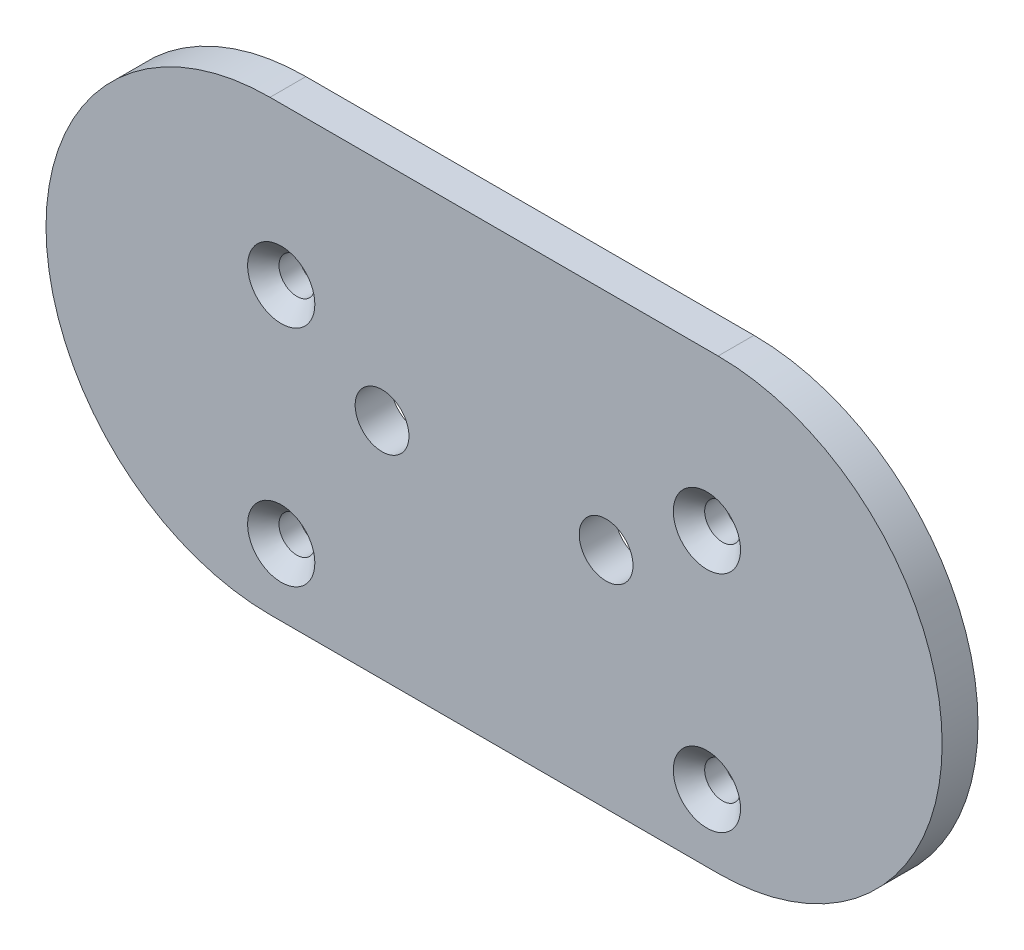
ISO-10303-21;
HEADER;
FILE_DESCRIPTION(('STEP AP214'),'2;1');
FILE_NAME('part.step','',(''),(''),'','','');
FILE_SCHEMA(('AUTOMOTIVE_DESIGN { 1 0 10303 214 1 1 1 1 }'));
ENDSEC;
DATA;
#1=APPLICATION_CONTEXT('core data for automotive mechanical design processes');
#2=APPLICATION_PROTOCOL_DEFINITION('international standard','automotive_design',2000,#1);
#3=PRODUCT_CONTEXT('',#1,'mechanical');
#4=PRODUCT('Part','Part','',(#3));
#5=PRODUCT_RELATED_PRODUCT_CATEGORY('part','',(#4));
#6=PRODUCT_DEFINITION_FORMATION('','',#4);
#7=PRODUCT_DEFINITION_CONTEXT('part definition',#1,'design');
#8=PRODUCT_DEFINITION('design','',#6,#7);
#9=PRODUCT_DEFINITION_SHAPE('','',#8);
#10=(LENGTH_UNIT() NAMED_UNIT(*) SI_UNIT(.MILLI.,.METRE.));
#11=(NAMED_UNIT(*) PLANE_ANGLE_UNIT() SI_UNIT($,.RADIAN.));
#12=(NAMED_UNIT(*) SI_UNIT($,.STERADIAN.) SOLID_ANGLE_UNIT());
#13=UNCERTAINTY_MEASURE_WITH_UNIT(LENGTH_MEASURE(1.E-05),#10,'distance_accuracy_value','');
#14=(GEOMETRIC_REPRESENTATION_CONTEXT(3) GLOBAL_UNCERTAINTY_ASSIGNED_CONTEXT((#13)) GLOBAL_UNIT_ASSIGNED_CONTEXT((#10,
#11,#12)) REPRESENTATION_CONTEXT('',''));
#15=CARTESIAN_POINT('',(0.,0.,0.));
#16=DIRECTION('',(0.,0.,1.));
#17=DIRECTION('',(1.,0.,0.));
#18=AXIS2_PLACEMENT_3D('',#15,#16,#17);
#19=CARTESIAN_POINT('',(-20.,0.,3.2));
#20=DIRECTION('',(0.,0.,1.));
#21=DIRECTION('',(1.,0.,0.));
#22=AXIS2_PLACEMENT_3D('',#19,#20,#21);
#23=PLANE('',#22);
#24=CARTESIAN_POINT('',(19.,-14.,3.2));
#25=DIRECTION('',(0.,0.,1.));
#26=DIRECTION('',(1.,0.,0.));
#27=AXIS2_PLACEMENT_3D('',#24,#25,#26);
#28=CIRCLE('',#27,2.99999999999999);
#29=CARTESIAN_POINT('',(22.,-14.,3.2));
#30=VERTEX_POINT('',#29);
#31=EDGE_CURVE('E128',#30,#30,#28,.F.);
#32=ORIENTED_EDGE('',*,*,#31,.T.);
#33=EDGE_LOOP('',(#32));
#34=FACE_BOUND('',#33,.T.);
#35=CARTESIAN_POINT('',(18.9999999999999,6.,3.2));
#36=DIRECTION('',(0.,0.,1.));
#37=DIRECTION('',(1.,0.,0.));
#38=AXIS2_PLACEMENT_3D('',#35,#36,#37);
#39=CIRCLE('',#38,2.99999999999999);
#40=CARTESIAN_POINT('',(21.9999999999999,6.,3.2));
#41=VERTEX_POINT('',#40);
#42=EDGE_CURVE('E125',#41,#41,#39,.F.);
#43=ORIENTED_EDGE('',*,*,#42,.T.);
#44=EDGE_LOOP('',(#43));
#45=FACE_BOUND('',#44,.T.);
#46=CARTESIAN_POINT('',(-19.,-14.,3.2));
#47=DIRECTION('',(0.,0.,1.));
#48=DIRECTION('',(1.,0.,0.));
#49=AXIS2_PLACEMENT_3D('',#46,#47,#48);
#50=CIRCLE('',#49,2.99999999999998);
#51=CARTESIAN_POINT('',(-16.,-14.,3.2));
#52=VERTEX_POINT('',#51);
#53=EDGE_CURVE('E122',#52,#52,#50,.F.);
#54=ORIENTED_EDGE('',*,*,#53,.T.);
#55=EDGE_LOOP('',(#54));
#56=FACE_BOUND('',#55,.T.);
#57=CARTESIAN_POINT('',(-19.0000000000001,6.,3.2));
#58=DIRECTION('',(0.,0.,1.));
#59=DIRECTION('',(1.,0.,0.));
#60=AXIS2_PLACEMENT_3D('',#57,#58,#59);
#61=CIRCLE('',#60,2.99999999999998);
#62=CARTESIAN_POINT('',(-16.0000000000001,6.,3.2));
#63=VERTEX_POINT('',#62);
#64=EDGE_CURVE('E119',#63,#63,#61,.F.);
#65=ORIENTED_EDGE('',*,*,#64,.T.);
#66=EDGE_LOOP('',(#65));
#67=FACE_BOUND('',#66,.T.);
#68=CARTESIAN_POINT('',(-20.,0.,3.2));
#69=DIRECTION('',(0.,0.,1.));
#70=DIRECTION('',(1.,0.,0.));
#71=AXIS2_PLACEMENT_3D('',#68,#69,#70);
#72=CIRCLE('',#71,20.);
#73=CARTESIAN_POINT('',(-20.,20.,3.2));
#74=VERTEX_POINT('',#73);
#75=CARTESIAN_POINT('',(-20.,-20.,3.2));
#76=VERTEX_POINT('',#75);
#77=EDGE_CURVE('E91',#74,#76,#72,.T.);
#78=ORIENTED_EDGE('',*,*,#77,.T.);
#79=DIRECTION('',(1.,0.,0.));
#80=VECTOR('',#79,1.);
#81=CARTESIAN_POINT('',(-20.,-20.,3.2));
#82=LINE('',#81,#80);
#83=CARTESIAN_POINT('',(20.,-20.,3.2));
#84=VERTEX_POINT('',#83);
#85=EDGE_CURVE('E86',#76,#84,#82,.T.);
#86=ORIENTED_EDGE('',*,*,#85,.T.);
#87=CARTESIAN_POINT('',(20.,0.,3.2));
#88=DIRECTION('',(0.,0.,1.));
#89=DIRECTION('',(1.,0.,0.));
#90=AXIS2_PLACEMENT_3D('',#87,#88,#89);
#91=CIRCLE('',#90,20.);
#92=CARTESIAN_POINT('',(20.,20.,3.2));
#93=VERTEX_POINT('',#92);
#94=EDGE_CURVE('E89',#84,#93,#91,.T.);
#95=ORIENTED_EDGE('',*,*,#94,.T.);
#96=DIRECTION('',(-1.,0.,0.));
#97=VECTOR('',#96,1.);
#98=CARTESIAN_POINT('',(-20.,20.,3.2));
#99=LINE('',#98,#97);
#100=EDGE_CURVE('E55',#93,#74,#99,.T.);
#101=ORIENTED_EDGE('',*,*,#100,.T.);
#102=EDGE_LOOP('',(#78,#86,#95,#101));
#103=FACE_BOUND('',#102,.T.);
#104=CARTESIAN_POINT('',(-10.,0.,3.2));
#105=DIRECTION('',(0.,0.,1.));
#106=DIRECTION('',(1.,0.,0.));
#107=AXIS2_PLACEMENT_3D('',#104,#105,#106);
#108=CIRCLE('',#107,2.4);
#109=CARTESIAN_POINT('',(-7.6,0.,3.2));
#110=VERTEX_POINT('',#109);
#111=EDGE_CURVE('E214',#110,#110,#108,.T.);
#112=ORIENTED_EDGE('',*,*,#111,.F.);
#113=EDGE_LOOP('',(#112));
#114=FACE_BOUND('',#113,.T.);
#115=CARTESIAN_POINT('',(10.,0.,3.2));
#116=DIRECTION('',(0.,0.,1.));
#117=DIRECTION('',(1.,0.,0.));
#118=AXIS2_PLACEMENT_3D('',#115,#116,#117);
#119=CIRCLE('',#118,2.4);
#120=CARTESIAN_POINT('',(12.4,0.,3.2));
#121=VERTEX_POINT('',#120);
#122=EDGE_CURVE('E248',#121,#121,#119,.T.);
#123=ORIENTED_EDGE('',*,*,#122,.F.);
#124=EDGE_LOOP('',(#123));
#125=FACE_BOUND('',#124,.T.);
#126=ADVANCED_FACE('F37',(#34,#45,#56,#67,#103,#114,#125),#23,.T.);
#127=CARTESIAN_POINT('',(-20.,0.,0.));
#128=DIRECTION('',(0.,0.,1.));
#129=DIRECTION('',(1.,0.,0.));
#130=AXIS2_PLACEMENT_3D('',#127,#128,#129);
#131=PLANE('',#130);
#132=CARTESIAN_POINT('',(-20.,0.,0.));
#133=DIRECTION('',(0.,0.,1.));
#134=DIRECTION('',(1.,0.,0.));
#135=AXIS2_PLACEMENT_3D('',#132,#133,#134);
#136=CIRCLE('',#135,20.);
#137=CARTESIAN_POINT('',(-20.,20.,0.));
#138=VERTEX_POINT('',#137);
#139=CARTESIAN_POINT('',(-20.,-20.,0.));
#140=VERTEX_POINT('',#139);
#141=EDGE_CURVE('E106',#138,#140,#136,.T.);
#142=ORIENTED_EDGE('',*,*,#141,.F.);
#143=DIRECTION('',(-1.,0.,0.));
#144=VECTOR('',#143,1.);
#145=CARTESIAN_POINT('',(-20.,20.,0.));
#146=LINE('',#145,#144);
#147=CARTESIAN_POINT('',(20.,20.,0.));
#148=VERTEX_POINT('',#147);
#149=EDGE_CURVE('E78',#148,#138,#146,.T.);
#150=ORIENTED_EDGE('',*,*,#149,.F.);
#151=CARTESIAN_POINT('',(20.,0.,0.));
#152=DIRECTION('',(0.,0.,1.));
#153=DIRECTION('',(1.,0.,0.));
#154=AXIS2_PLACEMENT_3D('',#151,#152,#153);
#155=CIRCLE('',#154,20.);
#156=CARTESIAN_POINT('',(20.,-20.,0.));
#157=VERTEX_POINT('',#156);
#158=EDGE_CURVE('E72',#157,#148,#155,.T.);
#159=ORIENTED_EDGE('',*,*,#158,.F.);
#160=DIRECTION('',(1.,0.,0.));
#161=VECTOR('',#160,1.);
#162=CARTESIAN_POINT('',(-20.,-20.,0.));
#163=LINE('',#162,#161);
#164=EDGE_CURVE('E96',#140,#157,#163,.T.);
#165=ORIENTED_EDGE('',*,*,#164,.F.);
#166=EDGE_LOOP('',(#142,#150,#159,#165));
#167=FACE_BOUND('',#166,.T.);
#168=CARTESIAN_POINT('',(-19.,-14.,0.));
#169=DIRECTION('',(0.,0.,1.));
#170=DIRECTION('',(1.,0.,0.));
#171=AXIS2_PLACEMENT_3D('',#168,#169,#170);
#172=CIRCLE('',#171,1.6);
#173=CARTESIAN_POINT('',(-17.4,-14.,0.));
#174=VERTEX_POINT('',#173);
#175=EDGE_CURVE('E109',#174,#174,#172,.T.);
#176=ORIENTED_EDGE('',*,*,#175,.T.);
#177=EDGE_LOOP('',(#176));
#178=FACE_BOUND('',#177,.T.);
#179=CARTESIAN_POINT('',(-10.,0.,0.));
#180=DIRECTION('',(0.,0.,1.));
#181=DIRECTION('',(1.,0.,0.));
#182=AXIS2_PLACEMENT_3D('',#179,#180,#181);
#183=CIRCLE('',#182,2.4);
#184=CARTESIAN_POINT('',(-7.6,0.,0.));
#185=VERTEX_POINT('',#184);
#186=EDGE_CURVE('E210',#185,#185,#183,.T.);
#187=ORIENTED_EDGE('',*,*,#186,.T.);
#188=EDGE_LOOP('',(#187));
#189=FACE_BOUND('',#188,.T.);
#190=CARTESIAN_POINT('',(19.,-14.,0.));
#191=DIRECTION('',(0.,0.,1.));
#192=DIRECTION('',(1.,0.,0.));
#193=AXIS2_PLACEMENT_3D('',#190,#191,#192);
#194=CIRCLE('',#193,1.6);
#195=CARTESIAN_POINT('',(20.6,-14.,0.));
#196=VERTEX_POINT('',#195);
#197=EDGE_CURVE('E208',#196,#196,#194,.T.);
#198=ORIENTED_EDGE('',*,*,#197,.T.);
#199=EDGE_LOOP('',(#198));
#200=FACE_BOUND('',#199,.T.);
#201=CARTESIAN_POINT('',(18.9999999999999,6.,0.));
#202=DIRECTION('',(0.,0.,1.));
#203=DIRECTION('',(1.,0.,0.));
#204=AXIS2_PLACEMENT_3D('',#201,#202,#203);
#205=CIRCLE('',#204,1.6);
#206=CARTESIAN_POINT('',(20.5999999999999,6.,0.));
#207=VERTEX_POINT('',#206);
#208=EDGE_CURVE('E211',#207,#207,#205,.T.);
#209=ORIENTED_EDGE('',*,*,#208,.T.);
#210=EDGE_LOOP('',(#209));
#211=FACE_BOUND('',#210,.T.);
#212=CARTESIAN_POINT('',(-19.0000000000001,6.,0.));
#213=DIRECTION('',(0.,0.,1.));
#214=DIRECTION('',(1.,0.,0.));
#215=AXIS2_PLACEMENT_3D('',#212,#213,#214);
#216=CIRCLE('',#215,1.6);
#217=CARTESIAN_POINT('',(-17.4000000000001,6.,0.));
#218=VERTEX_POINT('',#217);
#219=EDGE_CURVE('E217',#218,#218,#216,.T.);
#220=ORIENTED_EDGE('',*,*,#219,.T.);
#221=EDGE_LOOP('',(#220));
#222=FACE_BOUND('',#221,.T.);
#223=CARTESIAN_POINT('',(10.,0.,0.));
#224=DIRECTION('',(0.,0.,1.));
#225=DIRECTION('',(1.,0.,0.));
#226=AXIS2_PLACEMENT_3D('',#223,#224,#225);
#227=CIRCLE('',#226,2.4);
#228=CARTESIAN_POINT('',(12.4,0.,0.));
#229=VERTEX_POINT('',#228);
#230=EDGE_CURVE('E250',#229,#229,#227,.T.);
#231=ORIENTED_EDGE('',*,*,#230,.T.);
#232=EDGE_LOOP('',(#231));
#233=FACE_BOUND('',#232,.T.);
#234=ADVANCED_FACE('F154',(#167,#178,#189,#200,#211,#222,#233),#131,.F.);
#235=CARTESIAN_POINT('',(-20.,0.,3.2));
#236=DIRECTION('',(0.,0.,-1.));
#237=DIRECTION('',(-1.,0.,0.));
#238=AXIS2_PLACEMENT_3D('',#235,#236,#237);
#239=CYLINDRICAL_SURFACE('',#238,20.);
#240=ORIENTED_EDGE('',*,*,#141,.T.);
#241=DIRECTION('',(0.,0.,-1.));
#242=VECTOR('',#241,1.);
#243=CARTESIAN_POINT('',(-20.,-20.,3.2));
#244=LINE('',#243,#242);
#245=EDGE_CURVE('E97',#76,#140,#244,.T.);
#246=ORIENTED_EDGE('',*,*,#245,.F.);
#247=ORIENTED_EDGE('',*,*,#77,.F.);
#248=DIRECTION('',(0.,0.,-1.));
#249=VECTOR('',#248,1.);
#250=CARTESIAN_POINT('',(-20.,20.,3.2));
#251=LINE('',#250,#249);
#252=EDGE_CURVE('E102',#74,#138,#251,.T.);
#253=ORIENTED_EDGE('',*,*,#252,.T.);
#254=EDGE_LOOP('',(#240,#246,#247,#253));
#255=FACE_BOUND('',#254,.T.);
#256=ADVANCED_FACE('F160',(#255),#239,.T.);
#257=CARTESIAN_POINT('',(-20.,-20.,3.2));
#258=DIRECTION('',(0.,1.,0.));
#259=DIRECTION('',(0.,0.,1.));
#260=AXIS2_PLACEMENT_3D('',#257,#258,#259);
#261=PLANE('',#260);
#262=ORIENTED_EDGE('',*,*,#164,.T.);
#263=DIRECTION('',(0.,0.,-1.));
#264=VECTOR('',#263,1.);
#265=CARTESIAN_POINT('',(20.,-20.,3.2));
#266=LINE('',#265,#264);
#267=EDGE_CURVE('E94',#84,#157,#266,.T.);
#268=ORIENTED_EDGE('',*,*,#267,.F.);
#269=ORIENTED_EDGE('',*,*,#85,.F.);
#270=ORIENTED_EDGE('',*,*,#245,.T.);
#271=EDGE_LOOP('',(#262,#268,#269,#270));
#272=FACE_BOUND('',#271,.T.);
#273=ADVANCED_FACE('F95',(#272),#261,.F.);
#274=CARTESIAN_POINT('',(20.,0.,3.2));
#275=DIRECTION('',(0.,0.,-1.));
#276=DIRECTION('',(-1.,0.,0.));
#277=AXIS2_PLACEMENT_3D('',#274,#275,#276);
#278=CYLINDRICAL_SURFACE('',#277,20.);
#279=ORIENTED_EDGE('',*,*,#158,.T.);
#280=DIRECTION('',(0.,0.,-1.));
#281=VECTOR('',#280,1.);
#282=CARTESIAN_POINT('',(20.,20.,3.2));
#283=LINE('',#282,#281);
#284=EDGE_CURVE('E98',#93,#148,#283,.T.);
#285=ORIENTED_EDGE('',*,*,#284,.F.);
#286=ORIENTED_EDGE('',*,*,#94,.F.);
#287=ORIENTED_EDGE('',*,*,#267,.T.);
#288=EDGE_LOOP('',(#279,#285,#286,#287));
#289=FACE_BOUND('',#288,.T.);
#290=ADVANCED_FACE('F100',(#289),#278,.T.);
#291=CARTESIAN_POINT('',(-20.,20.,3.2));
#292=DIRECTION('',(0.,-1.,0.));
#293=DIRECTION('',(0.,0.,-1.));
#294=AXIS2_PLACEMENT_3D('',#291,#292,#293);
#295=PLANE('',#294);
#296=ORIENTED_EDGE('',*,*,#149,.T.);
#297=ORIENTED_EDGE('',*,*,#252,.F.);
#298=ORIENTED_EDGE('',*,*,#100,.F.);
#299=ORIENTED_EDGE('',*,*,#284,.T.);
#300=EDGE_LOOP('',(#296,#297,#298,#299));
#301=FACE_BOUND('',#300,.T.);
#302=ADVANCED_FACE('F167',(#301),#295,.F.);
#303=CARTESIAN_POINT('',(-19.,-14.,3.2));
#304=DIRECTION('',(0.,0.,-1.));
#305=DIRECTION('',(-1.,0.,0.));
#306=AXIS2_PLACEMENT_3D('',#303,#304,#305);
#307=CYLINDRICAL_SURFACE('',#306,1.6);
#308=CARTESIAN_POINT('',(-19.,-14.,1.80000000000002));
#309=DIRECTION('',(0.,0.,1.));
#310=DIRECTION('',(1.,0.,0.));
#311=AXIS2_PLACEMENT_3D('',#308,#309,#310);
#312=CIRCLE('',#311,1.6);
#313=CARTESIAN_POINT('',(-17.4,-14.,1.80000000000002));
#314=VERTEX_POINT('',#313);
#315=EDGE_CURVE('E47',#314,#314,#312,.T.);
#316=ORIENTED_EDGE('',*,*,#315,.T.);
#317=EDGE_LOOP('',(#316));
#318=FACE_BOUND('',#317,.T.);
#319=ORIENTED_EDGE('',*,*,#175,.F.);
#320=EDGE_LOOP('',(#319));
#321=FACE_BOUND('',#320,.T.);
#322=ADVANCED_FACE('F136',(#318,#321),#307,.F.);
#323=CARTESIAN_POINT('',(-10.,0.,3.2));
#324=DIRECTION('',(0.,0.,-1.));
#325=DIRECTION('',(-1.,0.,0.));
#326=AXIS2_PLACEMENT_3D('',#323,#324,#325);
#327=CYLINDRICAL_SURFACE('',#326,2.4);
#328=ORIENTED_EDGE('',*,*,#111,.T.);
#329=EDGE_LOOP('',(#328));
#330=FACE_BOUND('',#329,.T.);
#331=ORIENTED_EDGE('',*,*,#186,.F.);
#332=EDGE_LOOP('',(#331));
#333=FACE_BOUND('',#332,.T.);
#334=ADVANCED_FACE('F204',(#330,#333),#327,.F.);
#335=CARTESIAN_POINT('',(19.,-14.,3.2));
#336=DIRECTION('',(0.,0.,-1.));
#337=DIRECTION('',(-1.,0.,0.));
#338=AXIS2_PLACEMENT_3D('',#335,#336,#337);
#339=CYLINDRICAL_SURFACE('',#338,1.6);
#340=CARTESIAN_POINT('',(19.,-14.,1.80000000000001));
#341=DIRECTION('',(0.,0.,1.));
#342=DIRECTION('',(1.,0.,0.));
#343=AXIS2_PLACEMENT_3D('',#340,#341,#342);
#344=CIRCLE('',#343,1.6);
#345=CARTESIAN_POINT('',(20.6,-14.,1.80000000000001));
#346=VERTEX_POINT('',#345);
#347=EDGE_CURVE('E116',#346,#346,#344,.T.);
#348=ORIENTED_EDGE('',*,*,#347,.T.);
#349=EDGE_LOOP('',(#348));
#350=FACE_BOUND('',#349,.T.);
#351=ORIENTED_EDGE('',*,*,#197,.F.);
#352=EDGE_LOOP('',(#351));
#353=FACE_BOUND('',#352,.T.);
#354=ADVANCED_FACE('F200',(#350,#353),#339,.F.);
#355=CARTESIAN_POINT('',(18.9999999999999,6.,3.2));
#356=DIRECTION('',(0.,0.,-1.));
#357=DIRECTION('',(-1.,0.,0.));
#358=AXIS2_PLACEMENT_3D('',#355,#356,#357);
#359=CYLINDRICAL_SURFACE('',#358,1.6);
#360=CARTESIAN_POINT('',(18.9999999999999,6.,1.80000000000001));
#361=DIRECTION('',(0.,0.,1.));
#362=DIRECTION('',(1.,0.,0.));
#363=AXIS2_PLACEMENT_3D('',#360,#361,#362);
#364=CIRCLE('',#363,1.6);
#365=CARTESIAN_POINT('',(20.5999999999999,6.,1.80000000000001));
#366=VERTEX_POINT('',#365);
#367=EDGE_CURVE('E131',#366,#366,#364,.T.);
#368=ORIENTED_EDGE('',*,*,#367,.T.);
#369=EDGE_LOOP('',(#368));
#370=FACE_BOUND('',#369,.T.);
#371=ORIENTED_EDGE('',*,*,#208,.F.);
#372=EDGE_LOOP('',(#371));
#373=FACE_BOUND('',#372,.T.);
#374=ADVANCED_FACE('F203',(#370,#373),#359,.F.);
#375=CARTESIAN_POINT('',(-19.0000000000001,6.,3.2));
#376=DIRECTION('',(0.,0.,-1.));
#377=DIRECTION('',(-1.,0.,0.));
#378=AXIS2_PLACEMENT_3D('',#375,#376,#377);
#379=CYLINDRICAL_SURFACE('',#378,1.6);
#380=CARTESIAN_POINT('',(-19.0000000000001,6.,1.80000000000002));
#381=DIRECTION('',(0.,0.,1.));
#382=DIRECTION('',(1.,0.,0.));
#383=AXIS2_PLACEMENT_3D('',#380,#381,#382);
#384=CIRCLE('',#383,1.6);
#385=CARTESIAN_POINT('',(-17.4000000000001,6.,1.80000000000002));
#386=VERTEX_POINT('',#385);
#387=EDGE_CURVE('E11',#386,#386,#384,.T.);
#388=ORIENTED_EDGE('',*,*,#387,.T.);
#389=EDGE_LOOP('',(#388));
#390=FACE_BOUND('',#389,.T.);
#391=ORIENTED_EDGE('',*,*,#219,.F.);
#392=EDGE_LOOP('',(#391));
#393=FACE_BOUND('',#392,.T.);
#394=ADVANCED_FACE('F193',(#390,#393),#379,.F.);
#395=CARTESIAN_POINT('',(10.,0.,3.2));
#396=DIRECTION('',(0.,0.,-1.));
#397=DIRECTION('',(-1.,0.,0.));
#398=AXIS2_PLACEMENT_3D('',#395,#396,#397);
#399=CYLINDRICAL_SURFACE('',#398,2.4);
#400=ORIENTED_EDGE('',*,*,#122,.T.);
#401=EDGE_LOOP('',(#400));
#402=FACE_BOUND('',#401,.T.);
#403=ORIENTED_EDGE('',*,*,#230,.F.);
#404=EDGE_LOOP('',(#403));
#405=FACE_BOUND('',#404,.T.);
#406=ADVANCED_FACE('F182',(#402,#405),#399,.F.);
#407=CARTESIAN_POINT('',(19.,-14.,1.80000000000001));
#408=DIRECTION('',(0.,0.,1.));
#409=DIRECTION('',(1.,0.,0.));
#410=AXIS2_PLACEMENT_3D('',#407,#408,#409);
#411=CONICAL_SURFACE('',#410,1.6,0.785398163397446);
#412=ORIENTED_EDGE('',*,*,#31,.F.);
#413=EDGE_LOOP('',(#412));
#414=FACE_BOUND('',#413,.T.);
#415=ORIENTED_EDGE('',*,*,#347,.F.);
#416=EDGE_LOOP('',(#415));
#417=FACE_BOUND('',#416,.T.);
#418=ADVANCED_FACE('F148',(#414,#417),#411,.F.);
#419=CARTESIAN_POINT('',(18.9999999999999,6.,1.80000000000001));
#420=DIRECTION('',(0.,0.,1.));
#421=DIRECTION('',(1.,0.,0.));
#422=AXIS2_PLACEMENT_3D('',#419,#420,#421);
#423=CONICAL_SURFACE('',#422,1.6,0.785398163397446);
#424=ORIENTED_EDGE('',*,*,#42,.F.);
#425=EDGE_LOOP('',(#424));
#426=FACE_BOUND('',#425,.T.);
#427=ORIENTED_EDGE('',*,*,#367,.F.);
#428=EDGE_LOOP('',(#427));
#429=FACE_BOUND('',#428,.T.);
#430=ADVANCED_FACE('F141',(#426,#429),#423,.F.);
#431=CARTESIAN_POINT('',(-19.,-14.,1.80000000000002));
#432=DIRECTION('',(0.,0.,1.));
#433=DIRECTION('',(1.,0.,0.));
#434=AXIS2_PLACEMENT_3D('',#431,#432,#433);
#435=CONICAL_SURFACE('',#434,1.6,0.785398163397446);
#436=ORIENTED_EDGE('',*,*,#53,.F.);
#437=EDGE_LOOP('',(#436));
#438=FACE_BOUND('',#437,.T.);
#439=ORIENTED_EDGE('',*,*,#315,.F.);
#440=EDGE_LOOP('',(#439));
#441=FACE_BOUND('',#440,.T.);
#442=ADVANCED_FACE('F139',(#438,#441),#435,.F.);
#443=CARTESIAN_POINT('',(-19.0000000000001,6.,1.80000000000002));
#444=DIRECTION('',(0.,0.,1.));
#445=DIRECTION('',(1.,0.,0.));
#446=AXIS2_PLACEMENT_3D('',#443,#444,#445);
#447=CONICAL_SURFACE('',#446,1.6,0.785398163397446);
#448=ORIENTED_EDGE('',*,*,#64,.F.);
#449=EDGE_LOOP('',(#448));
#450=FACE_BOUND('',#449,.T.);
#451=ORIENTED_EDGE('',*,*,#387,.F.);
#452=EDGE_LOOP('',(#451));
#453=FACE_BOUND('',#452,.T.);
#454=ADVANCED_FACE('F40',(#450,#453),#447,.F.);
#455=CLOSED_SHELL('',(#126,#234,#256,#273,#290,#302,#322,#334,#354,#374,#394,#406,#418,#430,
#442,#454));
#456=MANIFOLD_SOLID_BREP('B2',#455);
#457=ADVANCED_BREP_SHAPE_REPRESENTATION('',(#18,#456),#14);
#458=SHAPE_DEFINITION_REPRESENTATION(#9,#457);
ENDSEC;
END-ISO-10303-21;
